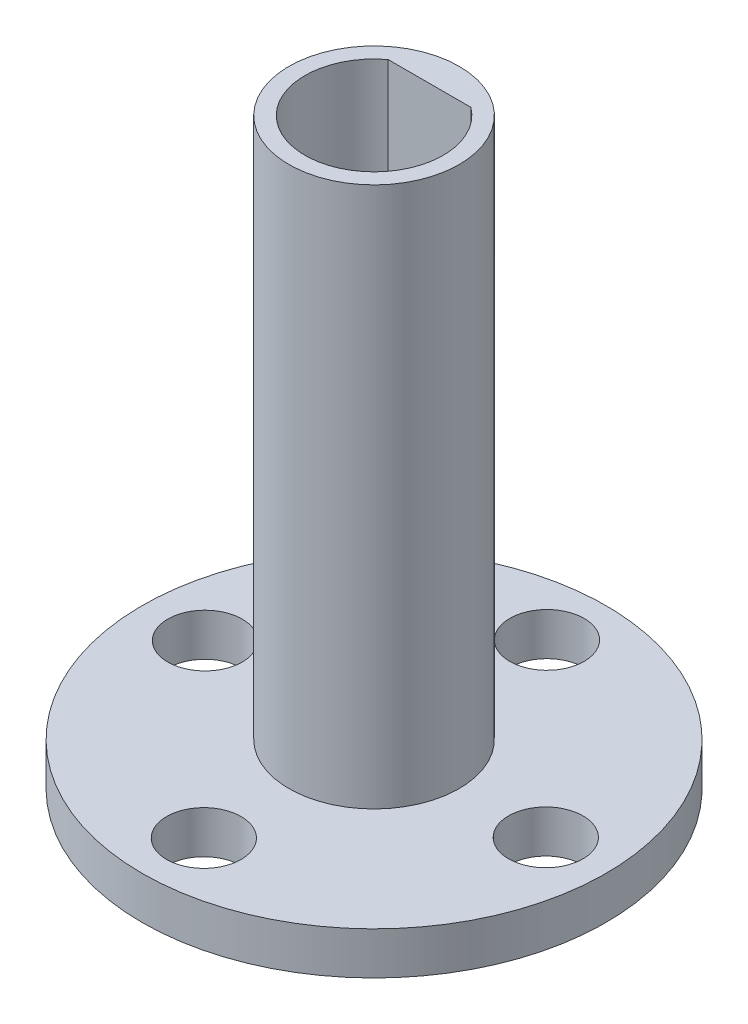
ISO-10303-21;
HEADER;
FILE_DESCRIPTION(('STEP AP214'),'2;1');
FILE_NAME('part.step','',(''),(''),'','','');
FILE_SCHEMA(('AUTOMOTIVE_DESIGN { 1 0 10303 214 1 1 1 1 }'));
ENDSEC;
DATA;
#1=APPLICATION_CONTEXT('core data for automotive mechanical design processes');
#2=APPLICATION_PROTOCOL_DEFINITION('international standard','automotive_design',2000,#1);
#3=PRODUCT_CONTEXT('',#1,'mechanical');
#4=PRODUCT('Part','Part','',(#3));
#5=PRODUCT_RELATED_PRODUCT_CATEGORY('part','',(#4));
#6=PRODUCT_DEFINITION_FORMATION('','',#4);
#7=PRODUCT_DEFINITION_CONTEXT('part definition',#1,'design');
#8=PRODUCT_DEFINITION('design','',#6,#7);
#9=PRODUCT_DEFINITION_SHAPE('','',#8);
#10=(LENGTH_UNIT() NAMED_UNIT(*) SI_UNIT(.MILLI.,.METRE.));
#11=(NAMED_UNIT(*) PLANE_ANGLE_UNIT() SI_UNIT($,.RADIAN.));
#12=(NAMED_UNIT(*) SI_UNIT($,.STERADIAN.) SOLID_ANGLE_UNIT());
#13=UNCERTAINTY_MEASURE_WITH_UNIT(LENGTH_MEASURE(1.E-05),#10,'distance_accuracy_value','');
#14=(GEOMETRIC_REPRESENTATION_CONTEXT(3) GLOBAL_UNCERTAINTY_ASSIGNED_CONTEXT((#13)) GLOBAL_UNIT_ASSIGNED_CONTEXT((#10,
#11,#12)) REPRESENTATION_CONTEXT('',''));
#15=CARTESIAN_POINT('',(0.,0.,0.));
#16=DIRECTION('',(0.,0.,1.));
#17=DIRECTION('',(1.,0.,0.));
#18=AXIS2_PLACEMENT_3D('',#15,#16,#17);
#19=CARTESIAN_POINT('',(0.,27.4,0.));
#20=DIRECTION('',(0.,1.,0.));
#21=DIRECTION('',(0.,0.,1.));
#22=AXIS2_PLACEMENT_3D('',#19,#20,#21);
#23=PLANE('',#22);
#24=CARTESIAN_POINT('',(0.,27.4,0.));
#25=DIRECTION('',(0.,1.,0.));
#26=DIRECTION('',(0.,0.,1.));
#27=AXIS2_PLACEMENT_3D('',#24,#25,#26);
#28=CIRCLE('',#27,4.);
#29=CARTESIAN_POINT('',(0.,27.4,-4.));
#30=VERTEX_POINT('',#29);
#31=EDGE_CURVE('E76',#30,#30,#28,.T.);
#32=ORIENTED_EDGE('',*,*,#31,.T.);
#33=EDGE_LOOP('',(#32));
#34=FACE_BOUND('',#33,.T.);
#35=DIRECTION('',(1.,0.,0.));
#36=VECTOR('',#35,1.);
#37=CARTESIAN_POINT('',(-1.94264577563398,27.4,-2.60549945123991));
#38=LINE('',#37,#36);
#39=CARTESIAN_POINT('',(-1.94264577563398,27.4,-2.60549945123991));
#40=VERTEX_POINT('',#39);
#41=CARTESIAN_POINT('',(1.94264577563398,27.4,-2.60549945123991));
#42=VERTEX_POINT('',#41);
#43=EDGE_CURVE('E104',#40,#42,#38,.T.);
#44=ORIENTED_EDGE('',*,*,#43,.T.);
#45=CARTESIAN_POINT('',(0.,27.4,0.));
#46=DIRECTION('',(0.,1.,0.));
#47=DIRECTION('',(0.,0.,1.));
#48=AXIS2_PLACEMENT_3D('',#45,#46,#47);
#49=CIRCLE('',#48,3.25);
#50=EDGE_CURVE('E108',#40,#42,#49,.T.);
#51=ORIENTED_EDGE('',*,*,#50,.F.);
#52=EDGE_LOOP('',(#44,#51));
#53=FACE_BOUND('',#52,.T.);
#54=ADVANCED_FACE('F68',(#34,#53),#23,.T.);
#55=CARTESIAN_POINT('',(0.,27.4,0.));
#56=DIRECTION('',(0.,-1.,0.));
#57=DIRECTION('',(0.,0.,-1.));
#58=AXIS2_PLACEMENT_3D('',#55,#56,#57);
#59=CYLINDRICAL_SURFACE('',#58,4.);
#60=CARTESIAN_POINT('',(0.,2.,0.));
#61=DIRECTION('',(0.,1.,0.));
#62=DIRECTION('',(0.,0.,1.));
#63=AXIS2_PLACEMENT_3D('',#60,#61,#62);
#64=CIRCLE('',#63,4.);
#65=CARTESIAN_POINT('',(0.,1.99999999999999,-4.));
#66=VERTEX_POINT('',#65);
#67=EDGE_CURVE('E99',#66,#66,#64,.T.);
#68=CARTESIAN_POINT('',(0.,1.99999999999999,-4.));
#69=CARTESIAN_POINT('',(0.,2.26458333333333,-4.));
#70=CARTESIAN_POINT('',(0.,2.52916666666666,-4.));
#71=CARTESIAN_POINT('',(0.,3.05833333333333,-4.));
#72=CARTESIAN_POINT('',(0.,3.32291666666666,-4.));
#73=CARTESIAN_POINT('',(0.,3.85208333333333,-4.));
#74=CARTESIAN_POINT('',(0.,4.11666666666666,-4.));
#75=CARTESIAN_POINT('',(0.,4.64583333333333,-4.));
#76=CARTESIAN_POINT('',(0.,4.91041666666666,-4.));
#77=CARTESIAN_POINT('',(0.,5.43958333333333,-4.));
#78=CARTESIAN_POINT('',(0.,5.70416666666666,-4.));
#79=CARTESIAN_POINT('',(0.,6.23333333333333,-4.));
#80=CARTESIAN_POINT('',(0.,6.49791666666666,-4.));
#81=CARTESIAN_POINT('',(0.,7.02708333333333,-4.));
#82=CARTESIAN_POINT('',(0.,7.29166666666666,-4.));
#83=CARTESIAN_POINT('',(0.,7.82083333333333,-4.));
#84=CARTESIAN_POINT('',(0.,8.08541666666666,-4.));
#85=CARTESIAN_POINT('',(0.,8.61458333333333,-4.));
#86=CARTESIAN_POINT('',(0.,8.87916666666666,-4.));
#87=CARTESIAN_POINT('',(0.,9.40833333333333,-4.));
#88=CARTESIAN_POINT('',(0.,9.67291666666666,-4.));
#89=CARTESIAN_POINT('',(0.,10.2020833333333,-4.));
#90=CARTESIAN_POINT('',(0.,10.4666666666667,-4.));
#91=CARTESIAN_POINT('',(0.,10.9958333333333,-4.));
#92=CARTESIAN_POINT('',(0.,11.2604166666667,-4.));
#93=CARTESIAN_POINT('',(0.,11.7895833333333,-4.));
#94=CARTESIAN_POINT('',(0.,12.0541666666667,-4.));
#95=CARTESIAN_POINT('',(0.,12.5833333333333,-4.));
#96=CARTESIAN_POINT('',(0.,12.8479166666667,-4.));
#97=CARTESIAN_POINT('',(0.,13.3770833333333,-4.));
#98=CARTESIAN_POINT('',(0.,13.6416666666667,-4.));
#99=CARTESIAN_POINT('',(0.,14.1708333333333,-4.));
#100=CARTESIAN_POINT('',(0.,14.4354166666667,-4.));
#101=CARTESIAN_POINT('',(0.,14.9645833333333,-4.));
#102=CARTESIAN_POINT('',(0.,15.2291666666667,-4.));
#103=CARTESIAN_POINT('',(0.,15.7583333333333,-4.));
#104=CARTESIAN_POINT('',(0.,16.0229166666667,-4.));
#105=CARTESIAN_POINT('',(0.,16.5520833333333,-4.));
#106=CARTESIAN_POINT('',(0.,16.8166666666667,-4.));
#107=CARTESIAN_POINT('',(0.,17.3458333333333,-4.));
#108=CARTESIAN_POINT('',(0.,17.6104166666667,-4.));
#109=CARTESIAN_POINT('',(0.,18.1395833333333,-4.));
#110=CARTESIAN_POINT('',(0.,18.4041666666667,-4.));
#111=CARTESIAN_POINT('',(0.,18.9333333333333,-4.));
#112=CARTESIAN_POINT('',(0.,19.1979166666667,-4.));
#113=CARTESIAN_POINT('',(0.,19.7270833333333,-4.));
#114=CARTESIAN_POINT('',(0.,19.9916666666667,-4.));
#115=CARTESIAN_POINT('',(0.,20.5208333333333,-4.));
#116=CARTESIAN_POINT('',(0.,20.7854166666667,-4.));
#117=CARTESIAN_POINT('',(0.,21.3145833333333,-4.));
#118=CARTESIAN_POINT('',(0.,21.5791666666667,-4.));
#119=CARTESIAN_POINT('',(0.,22.1083333333333,-4.));
#120=CARTESIAN_POINT('',(0.,22.3729166666667,-4.));
#121=CARTESIAN_POINT('',(0.,22.9020833333333,-4.));
#122=CARTESIAN_POINT('',(0.,23.1666666666667,-4.));
#123=CARTESIAN_POINT('',(0.,23.6958333333333,-4.));
#124=CARTESIAN_POINT('',(0.,23.9604166666667,-4.));
#125=CARTESIAN_POINT('',(0.,24.4895833333333,-4.));
#126=CARTESIAN_POINT('',(0.,24.7541666666667,-4.));
#127=CARTESIAN_POINT('',(0.,25.2833333333333,-4.));
#128=CARTESIAN_POINT('',(0.,25.5479166666667,-4.));
#129=CARTESIAN_POINT('',(0.,26.0770833333333,-4.));
#130=CARTESIAN_POINT('',(0.,26.3416666666667,-4.));
#131=CARTESIAN_POINT('',(0.,26.8708333333333,-4.));
#132=CARTESIAN_POINT('',(0.,27.1354166666667,-4.));
#133=CARTESIAN_POINT('',(0.,27.4,-4.));
#134=B_SPLINE_CURVE_WITH_KNOTS('',3,(#68,#69,#70,#71,#72,#73,#74,#75,#76,#77,#78,#79,#80,#81,
#82,#83,#84,#85,#86,#87,#88,#89,#90,#91,#92,#93,#94,#95,#96,#97,#98,#99,#100,#101,#102,#103,
#104,#105,#106,#107,#108,#109,#110,#111,#112,#113,#114,#115,#116,#117,#118,#119,#120,#121,#122,
#123,#124,#125,#126,#127,#128,#129,#130,#131,#132,#133),.UNSPECIFIED.,.F.,.F.,(4,2,2,2,2,2,2,2,
2,2,2,2,2,2,2,2,2,2,2,2,2,2,2,2,2,2,2,2,2,2,2,2,4),(0.,0.793749999999999,1.5875,2.38125,3.175,
3.96875,4.7625,5.55625,6.35,7.14375,7.9375,8.73125,9.525,10.31875,11.1125,11.90625,12.7,
13.49375,14.2875,15.08125,15.875,16.66875,17.4625,18.25625,19.05,19.84375,20.6375,21.43125,
22.225,23.01875,23.8125,24.60625,25.4),.UNSPECIFIED.);
#135=EDGE_CURVE('BSEAM70',#66,#30,#134,.T.);
#136=ORIENTED_EDGE('',*,*,#67,.T.);
#137=ORIENTED_EDGE('',*,*,#31,.F.);
#138=ORIENTED_EDGE('',*,*,#135,.T.);
#139=ORIENTED_EDGE('',*,*,#135,.F.);
#140=EDGE_LOOP('',(#136,#138,#137,#139));
#141=FACE_BOUND('',#140,.T.);
#142=ADVANCED_FACE('F70',(#141),#59,.T.);
#143=CARTESIAN_POINT('',(0.,27.4,0.));
#144=DIRECTION('',(0.,-1.,0.));
#145=DIRECTION('',(0.,0.,-1.));
#146=AXIS2_PLACEMENT_3D('',#143,#144,#145);
#147=CYLINDRICAL_SURFACE('',#146,3.25);
#148=CARTESIAN_POINT('',(0.,2.,0.));
#149=DIRECTION('',(0.,1.,0.));
#150=DIRECTION('',(0.,0.,1.));
#151=AXIS2_PLACEMENT_3D('',#148,#149,#150);
#152=CIRCLE('',#151,3.25);
#153=CARTESIAN_POINT('',(-1.94264577563398,2.,-2.60549945123991));
#154=VERTEX_POINT('',#153);
#155=CARTESIAN_POINT('',(1.94264577563398,2.00000000000001,-2.60549945123991));
#156=VERTEX_POINT('',#155);
#157=EDGE_CURVE('E82',#154,#156,#152,.T.);
#158=ORIENTED_EDGE('',*,*,#157,.F.);
#159=DIRECTION('',(0.,-1.,0.));
#160=VECTOR('',#159,1.);
#161=CARTESIAN_POINT('',(-1.94264577563398,27.4,-2.60549945123991));
#162=LINE('',#161,#160);
#163=EDGE_CURVE('E98',#40,#154,#162,.T.);
#164=ORIENTED_EDGE('',*,*,#163,.F.);
#165=ORIENTED_EDGE('',*,*,#50,.T.);
#166=DIRECTION('',(0.,-1.,0.));
#167=VECTOR('',#166,1.);
#168=CARTESIAN_POINT('',(1.94264577563398,27.4,-2.60549945123991));
#169=LINE('',#168,#167);
#170=EDGE_CURVE('E88',#42,#156,#169,.T.);
#171=ORIENTED_EDGE('',*,*,#170,.T.);
#172=EDGE_LOOP('',(#158,#164,#165,#171));
#173=FACE_BOUND('',#172,.T.);
#174=ADVANCED_FACE('F97',(#173),#147,.F.);
#175=CARTESIAN_POINT('',(-1.94264577563398,27.4,-2.60549945123991));
#176=DIRECTION('',(0.,0.,-1.));
#177=DIRECTION('',(-1.,0.,0.));
#178=AXIS2_PLACEMENT_3D('',#175,#176,#177);
#179=PLANE('',#178);
#180=ORIENTED_EDGE('',*,*,#163,.T.);
#181=DIRECTION('',(1.,0.,0.));
#182=VECTOR('',#181,1.);
#183=CARTESIAN_POINT('',(-1.94264577563398,2.,-2.60549945123991));
#184=LINE('',#183,#182);
#185=EDGE_CURVE('E12',#154,#156,#184,.T.);
#186=ORIENTED_EDGE('',*,*,#185,.T.);
#187=ORIENTED_EDGE('',*,*,#170,.F.);
#188=ORIENTED_EDGE('',*,*,#43,.F.);
#189=EDGE_LOOP('',(#180,#186,#187,#188));
#190=FACE_BOUND('',#189,.T.);
#191=ADVANCED_FACE('F102',(#190),#179,.F.);
#192=CARTESIAN_POINT('',(0.,2.,0.));
#193=DIRECTION('',(0.,1.,0.));
#194=DIRECTION('',(0.,0.,1.));
#195=AXIS2_PLACEMENT_3D('',#192,#193,#194);
#196=PLANE('',#195);
#197=ORIENTED_EDGE('',*,*,#185,.F.);
#198=ORIENTED_EDGE('',*,*,#157,.T.);
#199=EDGE_LOOP('',(#197,#198));
#200=FACE_BOUND('',#199,.T.);
#201=ADVANCED_FACE('F94',(#200),#196,.T.);
#202=CARTESIAN_POINT('',(8.01767982733765,2.,-0.0533357152510716));
#203=DIRECTION('',(0.,1.,0.));
#204=DIRECTION('',(0.,0.,1.));
#205=AXIS2_PLACEMENT_3D('',#202,#203,#204);
#206=CIRCLE('',#205,1.75);
#207=CARTESIAN_POINT('',(8.01767982733765,2.,1.69666428474893));
#208=VERTEX_POINT('',#207);
#209=EDGE_CURVE('E144',#208,#208,#206,.T.);
#210=ORIENTED_EDGE('',*,*,#209,.F.);
#211=EDGE_LOOP('',(#210));
#212=FACE_BOUND('',#211,.T.);
#213=CARTESIAN_POINT('',(-7.99946540436632,2.,-0.0531912101153402));
#214=DIRECTION('',(0.,1.,0.));
#215=DIRECTION('',(0.,0.,1.));
#216=AXIS2_PLACEMENT_3D('',#213,#214,#215);
#217=CIRCLE('',#216,1.75);
#218=CARTESIAN_POINT('',(-7.99946540436632,2.,1.69680878988466));
#219=VERTEX_POINT('',#218);
#220=EDGE_CURVE('E132',#219,#219,#217,.T.);
#221=ORIENTED_EDGE('',*,*,#220,.F.);
#222=EDGE_LOOP('',(#221));
#223=FACE_BOUND('',#222,.T.);
#224=CARTESIAN_POINT('',(0.,2.,0.));
#225=DIRECTION('',(0.,1.,0.));
#226=DIRECTION('',(0.,0.,1.));
#227=AXIS2_PLACEMENT_3D('',#224,#225,#226);
#228=CIRCLE('',#227,10.9);
#229=CARTESIAN_POINT('',(0.,2.,10.9));
#230=VERTEX_POINT('',#229);
#231=EDGE_CURVE('E100',#230,#230,#228,.T.);
#232=ORIENTED_EDGE('',*,*,#231,.T.);
#233=EDGE_LOOP('',(#232));
#234=FACE_BOUND('',#233,.T.);
#235=CARTESIAN_POINT('',(0.0091799489627781,2.,8.00905715153994));
#236=DIRECTION('',(0.,1.,0.));
#237=DIRECTION('',(0.,0.,1.));
#238=AXIS2_PLACEMENT_3D('',#235,#236,#237);
#239=CIRCLE('',#238,1.75);
#240=CARTESIAN_POINT('',(0.0091799489627781,2.,9.75905715153994));
#241=VERTEX_POINT('',#240);
#242=EDGE_CURVE('E138',#241,#241,#239,.T.);
#243=ORIENTED_EDGE('',*,*,#242,.F.);
#244=EDGE_LOOP('',(#243));
#245=FACE_BOUND('',#244,.T.);
#246=CARTESIAN_POINT('',(0.00903447400855788,2.,-8.11558407690636));
#247=DIRECTION('',(0.,1.,0.));
#248=DIRECTION('',(0.,0.,1.));
#249=AXIS2_PLACEMENT_3D('',#246,#247,#248);
#250=CIRCLE('',#249,1.75000000000001);
#251=CARTESIAN_POINT('',(0.00903447400855788,2.,-6.36558407690635));
#252=VERTEX_POINT('',#251);
#253=EDGE_CURVE('E150',#252,#252,#250,.T.);
#254=ORIENTED_EDGE('',*,*,#253,.F.);
#255=EDGE_LOOP('',(#254));
#256=FACE_BOUND('',#255,.T.);
#257=ORIENTED_EDGE('',*,*,#67,.F.);
#258=EDGE_LOOP('',(#257));
#259=FACE_BOUND('',#258,.T.);
#260=ADVANCED_FACE('F162',(#212,#223,#234,#245,#256,#259),#196,.T.);
#261=CARTESIAN_POINT('',(0.,2.,0.));
#262=DIRECTION('',(0.,-1.,0.));
#263=DIRECTION('',(0.,0.,-1.));
#264=AXIS2_PLACEMENT_3D('',#261,#262,#263);
#265=CYLINDRICAL_SURFACE('',#264,10.9);
#266=ORIENTED_EDGE('',*,*,#231,.F.);
#267=EDGE_LOOP('',(#266));
#268=FACE_BOUND('',#267,.T.);
#269=CARTESIAN_POINT('',(0.,0.,0.));
#270=DIRECTION('',(0.,1.,0.));
#271=DIRECTION('',(0.,0.,1.));
#272=AXIS2_PLACEMENT_3D('',#269,#270,#271);
#273=CIRCLE('',#272,10.9);
#274=CARTESIAN_POINT('',(0.,0.,10.9));
#275=VERTEX_POINT('',#274);
#276=EDGE_CURVE('E129',#275,#275,#273,.T.);
#277=ORIENTED_EDGE('',*,*,#276,.T.);
#278=EDGE_LOOP('',(#277));
#279=FACE_BOUND('',#278,.T.);
#280=ADVANCED_FACE('F164',(#268,#279),#265,.T.);
#281=CARTESIAN_POINT('',(-7.99946540436632,2.,-0.0531912101153402));
#282=DIRECTION('',(0.,-1.,0.));
#283=DIRECTION('',(0.,0.,-1.));
#284=AXIS2_PLACEMENT_3D('',#281,#282,#283);
#285=CYLINDRICAL_SURFACE('',#284,1.75);
#286=ORIENTED_EDGE('',*,*,#220,.T.);
#287=EDGE_LOOP('',(#286));
#288=FACE_BOUND('',#287,.T.);
#289=CARTESIAN_POINT('',(-7.99946540436632,0.,-0.0531912101153402));
#290=DIRECTION('',(0.,1.,0.));
#291=DIRECTION('',(0.,0.,1.));
#292=AXIS2_PLACEMENT_3D('',#289,#290,#291);
#293=CIRCLE('',#292,1.75);
#294=CARTESIAN_POINT('',(-7.99946540436632,0.,1.69680878988466));
#295=VERTEX_POINT('',#294);
#296=EDGE_CURVE('E135',#295,#295,#293,.T.);
#297=ORIENTED_EDGE('',*,*,#296,.F.);
#298=EDGE_LOOP('',(#297));
#299=FACE_BOUND('',#298,.T.);
#300=ADVANCED_FACE('F171',(#288,#299),#285,.F.);
#301=CARTESIAN_POINT('',(0.0091799489627781,2.,8.00905715153994));
#302=DIRECTION('',(0.,-1.,0.));
#303=DIRECTION('',(0.,0.,-1.));
#304=AXIS2_PLACEMENT_3D('',#301,#302,#303);
#305=CYLINDRICAL_SURFACE('',#304,1.75);
#306=ORIENTED_EDGE('',*,*,#242,.T.);
#307=EDGE_LOOP('',(#306));
#308=FACE_BOUND('',#307,.T.);
#309=CARTESIAN_POINT('',(0.0091799489627781,0.,8.00905715153994));
#310=DIRECTION('',(0.,1.,0.));
#311=DIRECTION('',(0.,0.,1.));
#312=AXIS2_PLACEMENT_3D('',#309,#310,#311);
#313=CIRCLE('',#312,1.75);
#314=CARTESIAN_POINT('',(0.0091799489627781,0.,9.75905715153994));
#315=VERTEX_POINT('',#314);
#316=EDGE_CURVE('E141',#315,#315,#313,.T.);
#317=ORIENTED_EDGE('',*,*,#316,.F.);
#318=EDGE_LOOP('',(#317));
#319=FACE_BOUND('',#318,.T.);
#320=ADVANCED_FACE('F200',(#308,#319),#305,.F.);
#321=CARTESIAN_POINT('',(8.01767982733765,2.,-0.0533357152510716));
#322=DIRECTION('',(0.,-1.,0.));
#323=DIRECTION('',(0.,0.,-1.));
#324=AXIS2_PLACEMENT_3D('',#321,#322,#323);
#325=CYLINDRICAL_SURFACE('',#324,1.75);
#326=ORIENTED_EDGE('',*,*,#209,.T.);
#327=EDGE_LOOP('',(#326));
#328=FACE_BOUND('',#327,.T.);
#329=CARTESIAN_POINT('',(8.01767982733765,0.,-0.0533357152510716));
#330=DIRECTION('',(0.,1.,0.));
#331=DIRECTION('',(0.,0.,1.));
#332=AXIS2_PLACEMENT_3D('',#329,#330,#331);
#333=CIRCLE('',#332,1.75);
#334=CARTESIAN_POINT('',(8.01767982733765,0.,1.69666428474893));
#335=VERTEX_POINT('',#334);
#336=EDGE_CURVE('E147',#335,#335,#333,.T.);
#337=ORIENTED_EDGE('',*,*,#336,.F.);
#338=EDGE_LOOP('',(#337));
#339=FACE_BOUND('',#338,.T.);
#340=ADVANCED_FACE('F186',(#328,#339),#325,.F.);
#341=CARTESIAN_POINT('',(0.00903447400855788,2.,-8.11558407690636));
#342=DIRECTION('',(0.,-1.,0.));
#343=DIRECTION('',(0.,0.,-1.));
#344=AXIS2_PLACEMENT_3D('',#341,#342,#343);
#345=CYLINDRICAL_SURFACE('',#344,1.75000000000001);
#346=ORIENTED_EDGE('',*,*,#253,.T.);
#347=EDGE_LOOP('',(#346));
#348=FACE_BOUND('',#347,.T.);
#349=CARTESIAN_POINT('',(0.00903447400855788,0.,-8.11558407690636));
#350=DIRECTION('',(0.,1.,0.));
#351=DIRECTION('',(0.,0.,1.));
#352=AXIS2_PLACEMENT_3D('',#349,#350,#351);
#353=CIRCLE('',#352,1.75000000000001);
#354=CARTESIAN_POINT('',(0.00903447400855788,0.,-6.36558407690635));
#355=VERTEX_POINT('',#354);
#356=EDGE_CURVE('E153',#355,#355,#353,.T.);
#357=ORIENTED_EDGE('',*,*,#356,.F.);
#358=EDGE_LOOP('',(#357));
#359=FACE_BOUND('',#358,.T.);
#360=ADVANCED_FACE('F159',(#348,#359),#345,.F.);
#361=CARTESIAN_POINT('',(0.,0.,0.));
#362=DIRECTION('',(0.,1.,0.));
#363=DIRECTION('',(0.,0.,1.));
#364=AXIS2_PLACEMENT_3D('',#361,#362,#363);
#365=PLANE('',#364);
#366=ORIENTED_EDGE('',*,*,#356,.T.);
#367=EDGE_LOOP('',(#366));
#368=FACE_BOUND('',#367,.T.);
#369=ORIENTED_EDGE('',*,*,#336,.T.);
#370=EDGE_LOOP('',(#369));
#371=FACE_BOUND('',#370,.T.);
#372=ORIENTED_EDGE('',*,*,#316,.T.);
#373=EDGE_LOOP('',(#372));
#374=FACE_BOUND('',#373,.T.);
#375=ORIENTED_EDGE('',*,*,#296,.T.);
#376=EDGE_LOOP('',(#375));
#377=FACE_BOUND('',#376,.T.);
#378=ORIENTED_EDGE('',*,*,#276,.F.);
#379=EDGE_LOOP('',(#378));
#380=FACE_BOUND('',#379,.T.);
#381=ADVANCED_FACE('F180',(#368,#371,#374,#377,#380),#365,.F.);
#382=CLOSED_SHELL('',(#54,#142,#174,#191,#201,#260,#280,#300,#320,#340,#360,#381));
#383=MANIFOLD_SOLID_BREP('B2',#382);
#384=ADVANCED_BREP_SHAPE_REPRESENTATION('',(#18,#383),#14);
#385=SHAPE_DEFINITION_REPRESENTATION(#9,#384);
ENDSEC;
END-ISO-10303-21;
